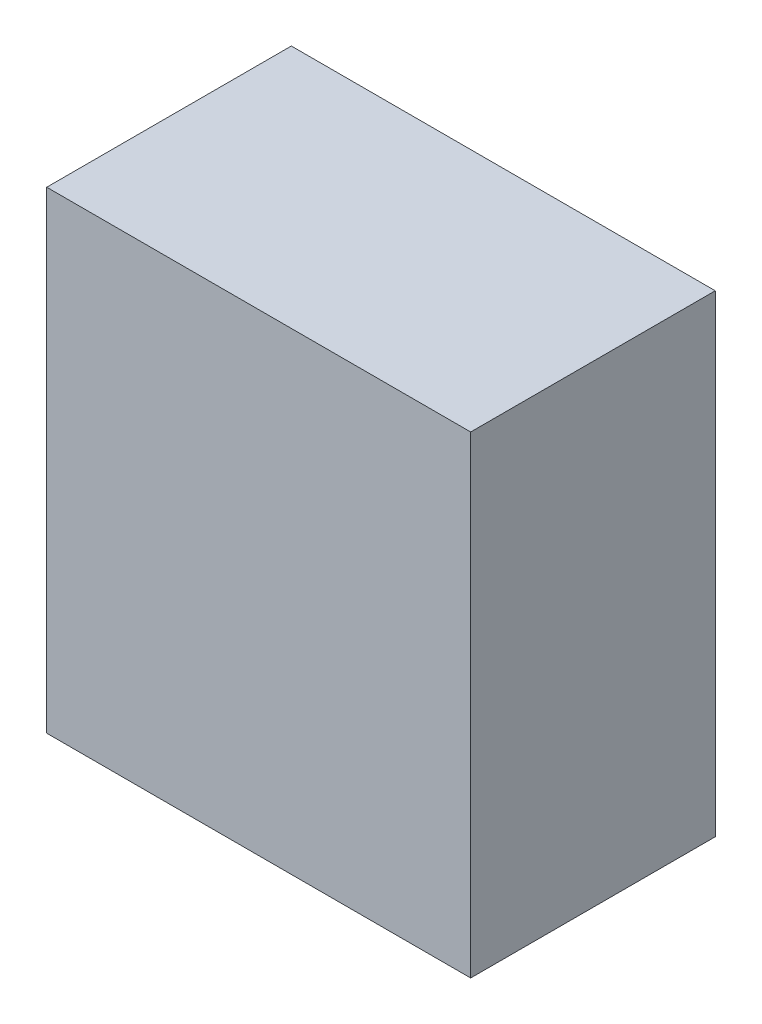
ISO-10303-21;
HEADER;
FILE_DESCRIPTION(('STEP AP214'),'2;1');
FILE_NAME('part.step','',(''),(''),'','','');
FILE_SCHEMA(('AUTOMOTIVE_DESIGN { 1 0 10303 214 1 1 1 1 }'));
ENDSEC;
DATA;
#1=APPLICATION_CONTEXT('core data for automotive mechanical design processes');
#2=APPLICATION_PROTOCOL_DEFINITION('international standard','automotive_design',2000,#1);
#3=PRODUCT_CONTEXT('',#1,'mechanical');
#4=PRODUCT('Part','Part','',(#3));
#5=PRODUCT_RELATED_PRODUCT_CATEGORY('part','',(#4));
#6=PRODUCT_DEFINITION_FORMATION('','',#4);
#7=PRODUCT_DEFINITION_CONTEXT('part definition',#1,'design');
#8=PRODUCT_DEFINITION('design','',#6,#7);
#9=PRODUCT_DEFINITION_SHAPE('','',#8);
#10=(LENGTH_UNIT() NAMED_UNIT(*) SI_UNIT(.MILLI.,.METRE.));
#11=(NAMED_UNIT(*) PLANE_ANGLE_UNIT() SI_UNIT($,.RADIAN.));
#12=(NAMED_UNIT(*) SI_UNIT($,.STERADIAN.) SOLID_ANGLE_UNIT());
#13=UNCERTAINTY_MEASURE_WITH_UNIT(LENGTH_MEASURE(1.E-05),#10,'distance_accuracy_value','');
#14=(GEOMETRIC_REPRESENTATION_CONTEXT(3) GLOBAL_UNCERTAINTY_ASSIGNED_CONTEXT((#13)) GLOBAL_UNIT_ASSIGNED_CONTEXT((#10,
#11,#12)) REPRESENTATION_CONTEXT('',''));
#15=CARTESIAN_POINT('',(0.,0.,0.));
#16=DIRECTION('',(0.,0.,1.));
#17=DIRECTION('',(1.,0.,0.));
#18=AXIS2_PLACEMENT_3D('',#15,#16,#17);
#19=CARTESIAN_POINT('',(26.,29.,30.));
#20=DIRECTION('',(-1.,0.,0.));
#21=DIRECTION('',(0.,-1.,0.));
#22=AXIS2_PLACEMENT_3D('',#19,#20,#21);
#23=PLANE('',#22);
#24=DIRECTION('',(0.,1.,0.));
#25=VECTOR('',#24,1.);
#26=CARTESIAN_POINT('',(26.,29.,0.));
#27=LINE('',#26,#25);
#28=CARTESIAN_POINT('',(26.,-29.,0.));
#29=VERTEX_POINT('',#28);
#30=CARTESIAN_POINT('',(26.,29.,0.));
#31=VERTEX_POINT('',#30);
#32=EDGE_CURVE('E102',#29,#31,#27,.T.);
#33=ORIENTED_EDGE('',*,*,#32,.T.);
#34=DIRECTION('',(0.,0.,-1.));
#35=VECTOR('',#34,1.);
#36=CARTESIAN_POINT('',(26.,29.,30.));
#37=LINE('',#36,#35);
#38=CARTESIAN_POINT('',(26.,29.,30.));
#39=VERTEX_POINT('',#38);
#40=EDGE_CURVE('E11',#39,#31,#37,.T.);
#41=ORIENTED_EDGE('',*,*,#40,.F.);
#42=DIRECTION('',(0.,1.,0.));
#43=VECTOR('',#42,1.);
#44=CARTESIAN_POINT('',(26.,29.,30.));
#45=LINE('',#44,#43);
#46=CARTESIAN_POINT('',(26.,-29.,30.));
#47=VERTEX_POINT('',#46);
#48=EDGE_CURVE('E90',#47,#39,#45,.T.);
#49=ORIENTED_EDGE('',*,*,#48,.F.);
#50=DIRECTION('',(0.,0.,-1.));
#51=VECTOR('',#50,1.);
#52=CARTESIAN_POINT('',(26.,-29.,30.));
#53=LINE('',#52,#51);
#54=EDGE_CURVE('E98',#47,#29,#53,.T.);
#55=ORIENTED_EDGE('',*,*,#54,.T.);
#56=EDGE_LOOP('',(#33,#41,#49,#55));
#57=FACE_BOUND('',#56,.T.);
#58=ADVANCED_FACE('F39',(#57),#23,.F.);
#59=CARTESIAN_POINT('',(-26.,29.,30.));
#60=DIRECTION('',(0.,-1.,0.));
#61=DIRECTION('',(0.,0.,-1.));
#62=AXIS2_PLACEMENT_3D('',#59,#60,#61);
#63=PLANE('',#62);
#64=DIRECTION('',(-1.,0.,0.));
#65=VECTOR('',#64,1.);
#66=CARTESIAN_POINT('',(-26.,29.,0.));
#67=LINE('',#66,#65);
#68=CARTESIAN_POINT('',(-26.,29.,0.));
#69=VERTEX_POINT('',#68);
#70=EDGE_CURVE('E94',#31,#69,#67,.T.);
#71=ORIENTED_EDGE('',*,*,#70,.T.);
#72=DIRECTION('',(0.,0.,-1.));
#73=VECTOR('',#72,1.);
#74=CARTESIAN_POINT('',(-26.,29.,30.));
#75=LINE('',#74,#73);
#76=CARTESIAN_POINT('',(-26.,29.,30.));
#77=VERTEX_POINT('',#76);
#78=EDGE_CURVE('E47',#77,#69,#75,.T.);
#79=ORIENTED_EDGE('',*,*,#78,.F.);
#80=DIRECTION('',(-1.,0.,0.));
#81=VECTOR('',#80,1.);
#82=CARTESIAN_POINT('',(-26.,29.,30.));
#83=LINE('',#82,#81);
#84=EDGE_CURVE('E85',#39,#77,#83,.T.);
#85=ORIENTED_EDGE('',*,*,#84,.F.);
#86=ORIENTED_EDGE('',*,*,#40,.T.);
#87=EDGE_LOOP('',(#71,#79,#85,#86));
#88=FACE_BOUND('',#87,.T.);
#89=ADVANCED_FACE('F93',(#88),#63,.F.);
#90=CARTESIAN_POINT('',(-26.,29.,30.));
#91=DIRECTION('',(1.,0.,0.));
#92=DIRECTION('',(0.,1.,0.));
#93=AXIS2_PLACEMENT_3D('',#90,#91,#92);
#94=PLANE('',#93);
#95=DIRECTION('',(0.,-1.,0.));
#96=VECTOR('',#95,1.);
#97=CARTESIAN_POINT('',(-26.,29.,0.));
#98=LINE('',#97,#96);
#99=CARTESIAN_POINT('',(-26.,-29.,0.));
#100=VERTEX_POINT('',#99);
#101=EDGE_CURVE('E72',#69,#100,#98,.T.);
#102=ORIENTED_EDGE('',*,*,#101,.T.);
#103=DIRECTION('',(0.,0.,-1.));
#104=VECTOR('',#103,1.);
#105=CARTESIAN_POINT('',(-26.,-29.,30.));
#106=LINE('',#105,#104);
#107=CARTESIAN_POINT('',(-26.,-29.,30.));
#108=VERTEX_POINT('',#107);
#109=EDGE_CURVE('E95',#108,#100,#106,.T.);
#110=ORIENTED_EDGE('',*,*,#109,.F.);
#111=DIRECTION('',(0.,-1.,0.));
#112=VECTOR('',#111,1.);
#113=CARTESIAN_POINT('',(-26.,29.,30.));
#114=LINE('',#113,#112);
#115=EDGE_CURVE('E88',#77,#108,#114,.T.);
#116=ORIENTED_EDGE('',*,*,#115,.F.);
#117=ORIENTED_EDGE('',*,*,#78,.T.);
#118=EDGE_LOOP('',(#102,#110,#116,#117));
#119=FACE_BOUND('',#118,.T.);
#120=ADVANCED_FACE('F96',(#119),#94,.F.);
#121=CARTESIAN_POINT('',(-26.,-29.,30.));
#122=DIRECTION('',(0.,1.,0.));
#123=DIRECTION('',(0.,0.,1.));
#124=AXIS2_PLACEMENT_3D('',#121,#122,#123);
#125=PLANE('',#124);
#126=DIRECTION('',(1.,0.,0.));
#127=VECTOR('',#126,1.);
#128=CARTESIAN_POINT('',(-26.,-29.,0.));
#129=LINE('',#128,#127);
#130=EDGE_CURVE('E78',#100,#29,#129,.T.);
#131=ORIENTED_EDGE('',*,*,#130,.T.);
#132=ORIENTED_EDGE('',*,*,#54,.F.);
#133=DIRECTION('',(1.,0.,0.));
#134=VECTOR('',#133,1.);
#135=CARTESIAN_POINT('',(-26.,-29.,30.));
#136=LINE('',#135,#134);
#137=EDGE_CURVE('E55',#108,#47,#136,.T.);
#138=ORIENTED_EDGE('',*,*,#137,.F.);
#139=ORIENTED_EDGE('',*,*,#109,.T.);
#140=EDGE_LOOP('',(#131,#132,#138,#139));
#141=FACE_BOUND('',#140,.T.);
#142=ADVANCED_FACE('F109',(#141),#125,.F.);
#143=CARTESIAN_POINT('',(0.,0.,30.));
#144=DIRECTION('',(0.,0.,1.));
#145=DIRECTION('',(1.,0.,0.));
#146=AXIS2_PLACEMENT_3D('',#143,#144,#145);
#147=PLANE('',#146);
#148=ORIENTED_EDGE('',*,*,#48,.T.);
#149=ORIENTED_EDGE('',*,*,#84,.T.);
#150=ORIENTED_EDGE('',*,*,#115,.T.);
#151=ORIENTED_EDGE('',*,*,#137,.T.);
#152=EDGE_LOOP('',(#148,#149,#150,#151));
#153=FACE_BOUND('',#152,.T.);
#154=ADVANCED_FACE('F86',(#153),#147,.T.);
#155=CARTESIAN_POINT('',(0.,0.,0.));
#156=DIRECTION('',(0.,0.,1.));
#157=DIRECTION('',(1.,0.,0.));
#158=AXIS2_PLACEMENT_3D('',#155,#156,#157);
#159=PLANE('',#158);
#160=ORIENTED_EDGE('',*,*,#32,.F.);
#161=ORIENTED_EDGE('',*,*,#130,.F.);
#162=ORIENTED_EDGE('',*,*,#101,.F.);
#163=ORIENTED_EDGE('',*,*,#70,.F.);
#164=EDGE_LOOP('',(#160,#161,#162,#163));
#165=FACE_BOUND('',#164,.T.);
#166=ADVANCED_FACE('F112',(#165),#159,.F.);
#167=CLOSED_SHELL('',(#58,#89,#120,#142,#154,#166));
#168=MANIFOLD_SOLID_BREP('B2',#167);
#169=ADVANCED_BREP_SHAPE_REPRESENTATION('',(#18,#168),#14);
#170=SHAPE_DEFINITION_REPRESENTATION(#9,#169);
ENDSEC;
END-ISO-10303-21;
